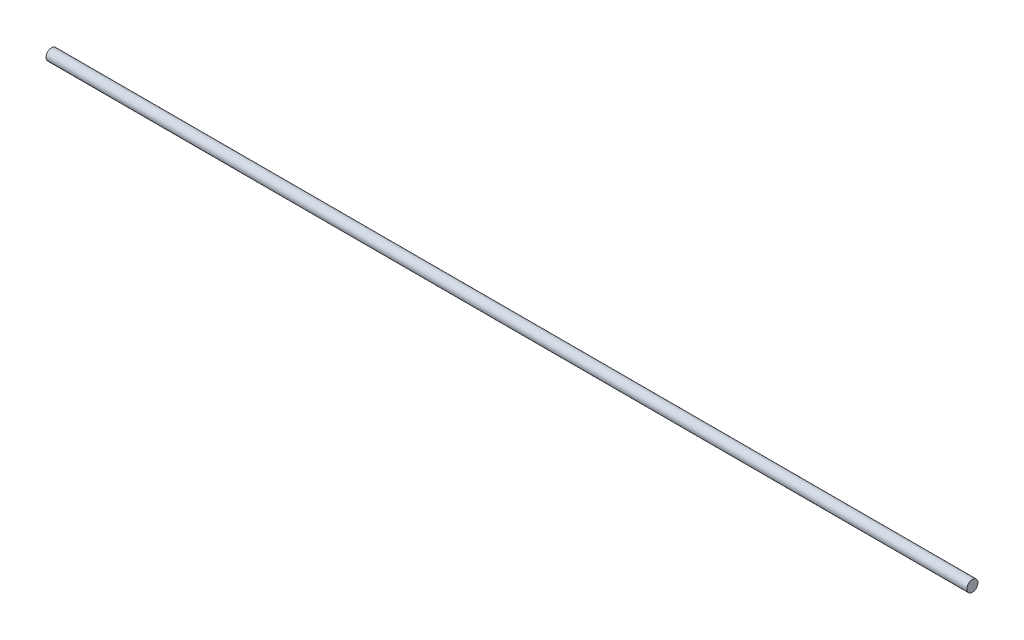
ISO-10303-21;
HEADER;
FILE_DESCRIPTION(('STEP AP214'),'2;1');
FILE_NAME('part.step','',(''),(''),'','','');
FILE_SCHEMA(('AUTOMOTIVE_DESIGN { 1 0 10303 214 1 1 1 1 }'));
ENDSEC;
DATA;
#1=APPLICATION_CONTEXT('core data for automotive mechanical design processes');
#2=APPLICATION_PROTOCOL_DEFINITION('international standard','automotive_design',2000,#1);
#3=PRODUCT_CONTEXT('',#1,'mechanical');
#4=PRODUCT('Part','Part','',(#3));
#5=PRODUCT_RELATED_PRODUCT_CATEGORY('part','',(#4));
#6=PRODUCT_DEFINITION_FORMATION('','',#4);
#7=PRODUCT_DEFINITION_CONTEXT('part definition',#1,'design');
#8=PRODUCT_DEFINITION('design','',#6,#7);
#9=PRODUCT_DEFINITION_SHAPE('','',#8);
#10=(LENGTH_UNIT() NAMED_UNIT(*) SI_UNIT(.MILLI.,.METRE.));
#11=(NAMED_UNIT(*) PLANE_ANGLE_UNIT() SI_UNIT($,.RADIAN.));
#12=(NAMED_UNIT(*) SI_UNIT($,.STERADIAN.) SOLID_ANGLE_UNIT());
#13=UNCERTAINTY_MEASURE_WITH_UNIT(LENGTH_MEASURE(1.E-05),#10,'distance_accuracy_value','');
#14=(GEOMETRIC_REPRESENTATION_CONTEXT(3) GLOBAL_UNCERTAINTY_ASSIGNED_CONTEXT((#13)) GLOBAL_UNIT_ASSIGNED_CONTEXT((#10,
#11,#12)) REPRESENTATION_CONTEXT('',''));
#15=CARTESIAN_POINT('',(0.,0.,0.));
#16=DIRECTION('',(0.,0.,1.));
#17=DIRECTION('',(1.,0.,0.));
#18=AXIS2_PLACEMENT_3D('',#15,#16,#17);
#19=CARTESIAN_POINT('',(206.,0.,0.));
#20=DIRECTION('',(-1.,0.,0.));
#21=DIRECTION('',(0.,0.,1.));
#22=AXIS2_PLACEMENT_3D('',#19,#20,#21);
#23=CYLINDRICAL_SURFACE('',#22,2.5);
#24=CARTESIAN_POINT('',(206.,0.,0.));
#25=DIRECTION('',(1.,0.,0.));
#26=DIRECTION('',(0.,0.,-1.));
#27=AXIS2_PLACEMENT_3D('',#24,#25,#26);
#28=CIRCLE('',#27,2.5);
#29=CARTESIAN_POINT('',(206.,0.,-2.5));
#30=VERTEX_POINT('',#29);
#31=EDGE_CURVE('E10',#30,#30,#28,.T.);
#32=ORIENTED_EDGE('',*,*,#31,.F.);
#33=EDGE_LOOP('',(#32));
#34=FACE_BOUND('',#33,.T.);
#35=CARTESIAN_POINT('',(-206.,0.,0.));
#36=DIRECTION('',(1.,0.,0.));
#37=DIRECTION('',(0.,0.,-1.));
#38=AXIS2_PLACEMENT_3D('',#35,#36,#37);
#39=CIRCLE('',#38,2.5);
#40=CARTESIAN_POINT('',(-206.,0.,-2.5));
#41=VERTEX_POINT('',#40);
#42=EDGE_CURVE('E34',#41,#41,#39,.T.);
#43=ORIENTED_EDGE('',*,*,#42,.T.);
#44=EDGE_LOOP('',(#43));
#45=FACE_BOUND('',#44,.T.);
#46=ADVANCED_FACE('F31',(#34,#45),#23,.T.);
#47=CARTESIAN_POINT('',(206.,0.,0.));
#48=DIRECTION('',(1.,0.,0.));
#49=DIRECTION('',(0.,0.,-1.));
#50=AXIS2_PLACEMENT_3D('',#47,#48,#49);
#51=PLANE('',#50);
#52=ORIENTED_EDGE('',*,*,#31,.T.);
#53=EDGE_LOOP('',(#52));
#54=FACE_BOUND('',#53,.T.);
#55=ADVANCED_FACE('F46',(#54),#51,.T.);
#56=CARTESIAN_POINT('',(-206.,0.,0.));
#57=DIRECTION('',(1.,0.,0.));
#58=DIRECTION('',(0.,0.,-1.));
#59=AXIS2_PLACEMENT_3D('',#56,#57,#58);
#60=PLANE('',#59);
#61=ORIENTED_EDGE('',*,*,#42,.F.);
#62=EDGE_LOOP('',(#61));
#63=FACE_BOUND('',#62,.T.);
#64=ADVANCED_FACE('F44',(#63),#60,.F.);
#65=CLOSED_SHELL('',(#46,#55,#64));
#66=MANIFOLD_SOLID_BREP('B2',#65);
#67=ADVANCED_BREP_SHAPE_REPRESENTATION('',(#18,#66),#14);
#68=SHAPE_DEFINITION_REPRESENTATION(#9,#67);
ENDSEC;
END-ISO-10303-21;
